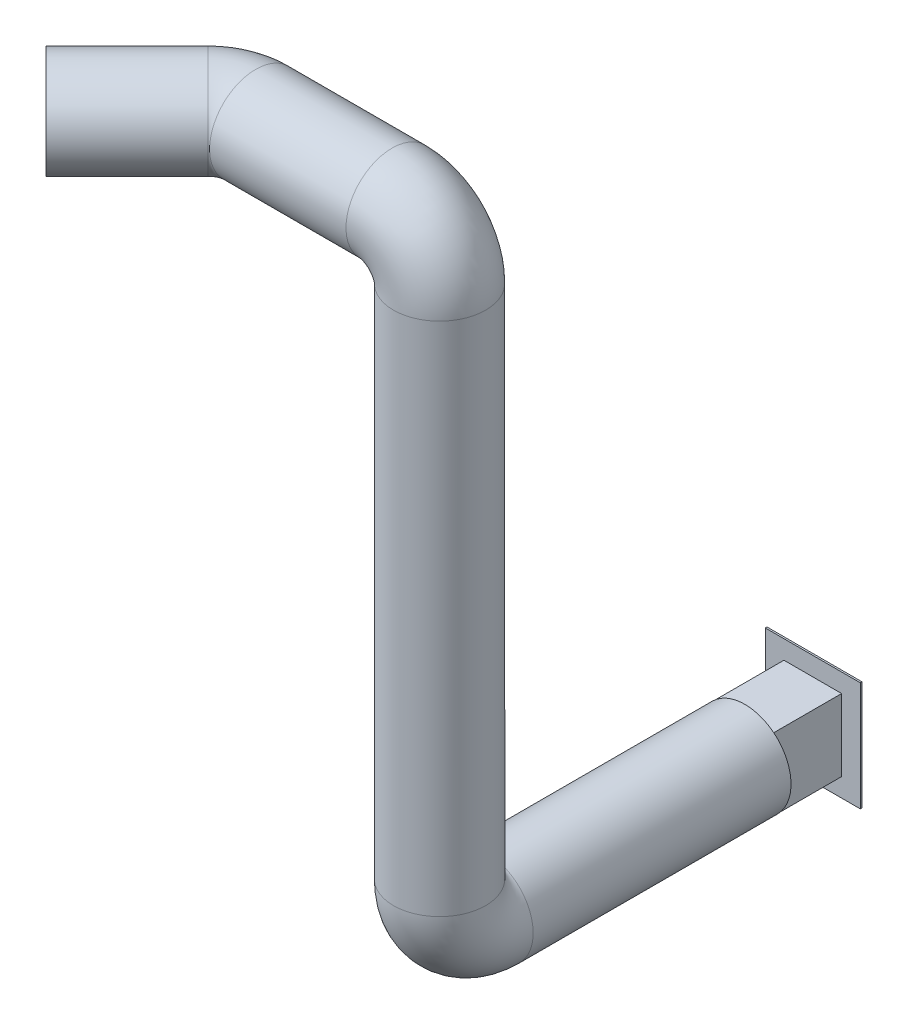
ISO-10303-21;
HEADER;
FILE_DESCRIPTION(('STEP AP214'),'2;1');
FILE_NAME('part.step','',(''),(''),'','','');
FILE_SCHEMA(('AUTOMOTIVE_DESIGN { 1 0 10303 214 1 1 1 1 }'));
ENDSEC;
DATA;
#1=APPLICATION_CONTEXT('core data for automotive mechanical design processes');
#2=APPLICATION_PROTOCOL_DEFINITION('international standard','automotive_design',2000,#1);
#3=PRODUCT_CONTEXT('',#1,'mechanical');
#4=PRODUCT('Part','Part','',(#3));
#5=PRODUCT_RELATED_PRODUCT_CATEGORY('part','',(#4));
#6=PRODUCT_DEFINITION_FORMATION('','',#4);
#7=PRODUCT_DEFINITION_CONTEXT('part definition',#1,'design');
#8=PRODUCT_DEFINITION('design','',#6,#7);
#9=PRODUCT_DEFINITION_SHAPE('','',#8);
#10=(LENGTH_UNIT() NAMED_UNIT(*) SI_UNIT(.MILLI.,.METRE.));
#11=(NAMED_UNIT(*) PLANE_ANGLE_UNIT() SI_UNIT($,.RADIAN.));
#12=(NAMED_UNIT(*) SI_UNIT($,.STERADIAN.) SOLID_ANGLE_UNIT());
#13=UNCERTAINTY_MEASURE_WITH_UNIT(LENGTH_MEASURE(1.E-05),#10,'distance_accuracy_value','');
#14=(GEOMETRIC_REPRESENTATION_CONTEXT(3) GLOBAL_UNCERTAINTY_ASSIGNED_CONTEXT((#13)) GLOBAL_UNIT_ASSIGNED_CONTEXT((#10,
#11,#12)) REPRESENTATION_CONTEXT('',''));
#15=CARTESIAN_POINT('',(0.,0.,0.));
#16=DIRECTION('',(0.,0.,1.));
#17=DIRECTION('',(1.,0.,0.));
#18=AXIS2_PLACEMENT_3D('',#15,#16,#17);
#19=CARTESIAN_POINT('',(0.,0.,2.5));
#20=DIRECTION('',(0.,0.,1.));
#21=DIRECTION('',(1.,0.,0.));
#22=AXIS2_PLACEMENT_3D('',#19,#20,#21);
#23=PLANE('',#22);
#24=DIRECTION('',(0.,-1.,0.));
#25=VECTOR('',#24,1.);
#26=CARTESIAN_POINT('',(0.,0.,2.5));
#27=LINE('',#26,#25);
#28=CARTESIAN_POINT('',(0.,0.,2.5));
#29=VERTEX_POINT('',#28);
#30=CARTESIAN_POINT('',(0.,-161.,2.5));
#31=VERTEX_POINT('',#30);
#32=EDGE_CURVE('E204',#29,#31,#27,.T.);
#33=ORIENTED_EDGE('',*,*,#32,.T.);
#34=DIRECTION('',(1.,0.,0.));
#35=VECTOR('',#34,1.);
#36=CARTESIAN_POINT('',(0.,-161.,2.5));
#37=LINE('',#36,#35);
#38=CARTESIAN_POINT('',(140.,-161.,2.5));
#39=VERTEX_POINT('',#38);
#40=EDGE_CURVE('E207',#31,#39,#37,.T.);
#41=ORIENTED_EDGE('',*,*,#40,.T.);
#42=DIRECTION('',(0.,1.,0.));
#43=VECTOR('',#42,1.);
#44=CARTESIAN_POINT('',(140.,0.,2.5));
#45=LINE('',#44,#43);
#46=CARTESIAN_POINT('',(140.,0.,2.5));
#47=VERTEX_POINT('',#46);
#48=EDGE_CURVE('E210',#39,#47,#45,.T.);
#49=ORIENTED_EDGE('',*,*,#48,.T.);
#50=DIRECTION('',(-1.,0.,0.));
#51=VECTOR('',#50,1.);
#52=CARTESIAN_POINT('',(0.,0.,2.5));
#53=LINE('',#52,#51);
#54=EDGE_CURVE('E212',#47,#29,#53,.T.);
#55=ORIENTED_EDGE('',*,*,#54,.T.);
#56=EDGE_LOOP('',(#33,#41,#49,#55));
#57=FACE_BOUND('',#56,.T.);
#58=DIRECTION('',(0.,-1.,0.));
#59=VECTOR('',#58,1.);
#60=CARTESIAN_POINT('',(27.5,-27.5,2.5));
#61=LINE('',#60,#59);
#62=CARTESIAN_POINT('',(27.5,-27.5,2.5));
#63=VERTEX_POINT('',#62);
#64=CARTESIAN_POINT('',(27.5,-133.5,2.5));
#65=VERTEX_POINT('',#64);
#66=EDGE_CURVE('E172',#63,#65,#61,.T.);
#67=ORIENTED_EDGE('',*,*,#66,.F.);
#68=DIRECTION('',(-1.,0.,0.));
#69=VECTOR('',#68,1.);
#70=CARTESIAN_POINT('',(27.5,-27.5,2.5));
#71=LINE('',#70,#69);
#72=CARTESIAN_POINT('',(112.5,-27.5,2.5));
#73=VERTEX_POINT('',#72);
#74=EDGE_CURVE('E155',#73,#63,#71,.T.);
#75=ORIENTED_EDGE('',*,*,#74,.F.);
#76=DIRECTION('',(0.,1.,0.));
#77=VECTOR('',#76,1.);
#78=CARTESIAN_POINT('',(112.5,-27.5,2.5));
#79=LINE('',#78,#77);
#80=CARTESIAN_POINT('',(112.5,-133.5,2.5));
#81=VERTEX_POINT('',#80);
#82=EDGE_CURVE('E160',#81,#73,#79,.T.);
#83=ORIENTED_EDGE('',*,*,#82,.F.);
#84=DIRECTION('',(1.,0.,0.));
#85=VECTOR('',#84,1.);
#86=CARTESIAN_POINT('',(27.5,-133.5,2.5));
#87=LINE('',#86,#85);
#88=EDGE_CURVE('E174',#65,#81,#87,.T.);
#89=ORIENTED_EDGE('',*,*,#88,.F.);
#90=EDGE_LOOP('',(#67,#75,#83,#89));
#91=FACE_BOUND('',#90,.T.);
#92=ADVANCED_FACE('F33',(#57,#91),#23,.T.);
#93=CARTESIAN_POINT('',(0.,0.,0.));
#94=DIRECTION('',(0.,0.,1.));
#95=DIRECTION('',(1.,0.,0.));
#96=AXIS2_PLACEMENT_3D('',#93,#94,#95);
#97=PLANE('',#96);
#98=DIRECTION('',(0.,-1.,0.));
#99=VECTOR('',#98,1.);
#100=CARTESIAN_POINT('',(0.,0.,0.));
#101=LINE('',#100,#99);
#102=CARTESIAN_POINT('',(0.,0.,0.));
#103=VERTEX_POINT('',#102);
#104=CARTESIAN_POINT('',(0.,-161.,0.));
#105=VERTEX_POINT('',#104);
#106=EDGE_CURVE('E203',#103,#105,#101,.T.);
#107=ORIENTED_EDGE('',*,*,#106,.F.);
#108=DIRECTION('',(-1.,0.,0.));
#109=VECTOR('',#108,1.);
#110=CARTESIAN_POINT('',(0.,0.,0.));
#111=LINE('',#110,#109);
#112=CARTESIAN_POINT('',(140.,0.,0.));
#113=VERTEX_POINT('',#112);
#114=EDGE_CURVE('E208',#113,#103,#111,.T.);
#115=ORIENTED_EDGE('',*,*,#114,.F.);
#116=DIRECTION('',(0.,1.,0.));
#117=VECTOR('',#116,1.);
#118=CARTESIAN_POINT('',(140.,0.,0.));
#119=LINE('',#118,#117);
#120=CARTESIAN_POINT('',(140.,-161.,0.));
#121=VERTEX_POINT('',#120);
#122=EDGE_CURVE('E219',#121,#113,#119,.T.);
#123=ORIENTED_EDGE('',*,*,#122,.F.);
#124=DIRECTION('',(1.,0.,0.));
#125=VECTOR('',#124,1.);
#126=CARTESIAN_POINT('',(0.,-161.,0.));
#127=LINE('',#126,#125);
#128=EDGE_CURVE('E217',#105,#121,#127,.T.);
#129=ORIENTED_EDGE('',*,*,#128,.F.);
#130=EDGE_LOOP('',(#107,#115,#123,#129));
#131=FACE_BOUND('',#130,.T.);
#132=DIRECTION('',(0.,1.,0.));
#133=VECTOR('',#132,1.);
#134=CARTESIAN_POINT('',(110.,-131.,0.));
#135=LINE('',#134,#133);
#136=CARTESIAN_POINT('',(110.,-131.,0.));
#137=VERTEX_POINT('',#136);
#138=CARTESIAN_POINT('',(110.,-30.,0.));
#139=VERTEX_POINT('',#138);
#140=EDGE_CURVE('E56',#137,#139,#135,.T.);
#141=ORIENTED_EDGE('',*,*,#140,.T.);
#142=DIRECTION('',(-1.,0.,0.));
#143=VECTOR('',#142,1.);
#144=CARTESIAN_POINT('',(30.,-30.,0.));
#145=LINE('',#144,#143);
#146=CARTESIAN_POINT('',(30.,-30.,0.));
#147=VERTEX_POINT('',#146);
#148=EDGE_CURVE('E186',#139,#147,#145,.T.);
#149=ORIENTED_EDGE('',*,*,#148,.T.);
#150=DIRECTION('',(0.,-1.,0.));
#151=VECTOR('',#150,1.);
#152=CARTESIAN_POINT('',(30.,-131.,0.));
#153=LINE('',#152,#151);
#154=CARTESIAN_POINT('',(30.,-131.,0.));
#155=VERTEX_POINT('',#154);
#156=EDGE_CURVE('E189',#147,#155,#153,.T.);
#157=ORIENTED_EDGE('',*,*,#156,.T.);
#158=DIRECTION('',(1.,0.,0.));
#159=VECTOR('',#158,1.);
#160=CARTESIAN_POINT('',(30.,-131.,0.));
#161=LINE('',#160,#159);
#162=EDGE_CURVE('E192',#155,#137,#161,.T.);
#163=ORIENTED_EDGE('',*,*,#162,.T.);
#164=EDGE_LOOP('',(#141,#149,#157,#163));
#165=FACE_BOUND('',#164,.T.);
#166=ADVANCED_FACE('F237',(#131,#165),#97,.F.);
#167=CARTESIAN_POINT('',(0.,0.,2.5));
#168=DIRECTION('',(1.,0.,0.));
#169=DIRECTION('',(0.,0.,-1.));
#170=AXIS2_PLACEMENT_3D('',#167,#168,#169);
#171=PLANE('',#170);
#172=ORIENTED_EDGE('',*,*,#106,.T.);
#173=DIRECTION('',(0.,0.,-1.));
#174=VECTOR('',#173,1.);
#175=CARTESIAN_POINT('',(0.,-161.,2.5));
#176=LINE('',#175,#174);
#177=EDGE_CURVE('E11',#31,#105,#176,.T.);
#178=ORIENTED_EDGE('',*,*,#177,.F.);
#179=ORIENTED_EDGE('',*,*,#32,.F.);
#180=DIRECTION('',(0.,0.,-1.));
#181=VECTOR('',#180,1.);
#182=CARTESIAN_POINT('',(0.,0.,2.5));
#183=LINE('',#182,#181);
#184=EDGE_CURVE('E214',#29,#103,#183,.T.);
#185=ORIENTED_EDGE('',*,*,#184,.T.);
#186=EDGE_LOOP('',(#172,#178,#179,#185));
#187=FACE_BOUND('',#186,.T.);
#188=ADVANCED_FACE('F35',(#187),#171,.F.);
#189=CARTESIAN_POINT('',(0.,-161.,2.5));
#190=DIRECTION('',(0.,1.,0.));
#191=DIRECTION('',(0.,0.,1.));
#192=AXIS2_PLACEMENT_3D('',#189,#190,#191);
#193=PLANE('',#192);
#194=ORIENTED_EDGE('',*,*,#128,.T.);
#195=DIRECTION('',(0.,0.,-1.));
#196=VECTOR('',#195,1.);
#197=CARTESIAN_POINT('',(140.,-161.,2.5));
#198=LINE('',#197,#196);
#199=EDGE_CURVE('E41',#39,#121,#198,.T.);
#200=ORIENTED_EDGE('',*,*,#199,.F.);
#201=ORIENTED_EDGE('',*,*,#40,.F.);
#202=ORIENTED_EDGE('',*,*,#177,.T.);
#203=EDGE_LOOP('',(#194,#200,#201,#202));
#204=FACE_BOUND('',#203,.T.);
#205=ADVANCED_FACE('F248',(#204),#193,.F.);
#206=CARTESIAN_POINT('',(140.,0.,2.5));
#207=DIRECTION('',(-1.,0.,0.));
#208=DIRECTION('',(0.,0.,1.));
#209=AXIS2_PLACEMENT_3D('',#206,#207,#208);
#210=PLANE('',#209);
#211=ORIENTED_EDGE('',*,*,#122,.T.);
#212=DIRECTION('',(0.,0.,-1.));
#213=VECTOR('',#212,1.);
#214=CARTESIAN_POINT('',(140.,0.,2.5));
#215=LINE('',#214,#213);
#216=EDGE_CURVE('E224',#47,#113,#215,.T.);
#217=ORIENTED_EDGE('',*,*,#216,.F.);
#218=ORIENTED_EDGE('',*,*,#48,.F.);
#219=ORIENTED_EDGE('',*,*,#199,.T.);
#220=EDGE_LOOP('',(#211,#217,#218,#219));
#221=FACE_BOUND('',#220,.T.);
#222=ADVANCED_FACE('F231',(#221),#210,.F.);
#223=CARTESIAN_POINT('',(0.,0.,2.5));
#224=DIRECTION('',(0.,-1.,0.));
#225=DIRECTION('',(1.,0.,0.));
#226=AXIS2_PLACEMENT_3D('',#223,#224,#225);
#227=PLANE('',#226);
#228=ORIENTED_EDGE('',*,*,#114,.T.);
#229=ORIENTED_EDGE('',*,*,#184,.F.);
#230=ORIENTED_EDGE('',*,*,#54,.F.);
#231=ORIENTED_EDGE('',*,*,#216,.T.);
#232=EDGE_LOOP('',(#228,#229,#230,#231));
#233=FACE_BOUND('',#232,.T.);
#234=ADVANCED_FACE('F241',(#233),#227,.F.);
#235=CARTESIAN_POINT('',(110.,-131.,2.5));
#236=DIRECTION('',(-1.,0.,0.));
#237=DIRECTION('',(0.,0.,1.));
#238=AXIS2_PLACEMENT_3D('',#235,#236,#237);
#239=PLANE('',#238);
#240=ORIENTED_EDGE('',*,*,#140,.F.);
#241=DIRECTION('',(0.,0.,-1.));
#242=VECTOR('',#241,1.);
#243=CARTESIAN_POINT('',(110.,-131.,2.5));
#244=LINE('',#243,#242);
#245=CARTESIAN_POINT('',(110.,-131.,102.5));
#246=VERTEX_POINT('',#245);
#247=EDGE_CURVE('E195',#246,#137,#244,.T.);
#248=ORIENTED_EDGE('',*,*,#247,.F.);
#249=DIRECTION('',(0.,1.,0.));
#250=VECTOR('',#249,1.);
#251=CARTESIAN_POINT('',(110.,-30.,102.5));
#252=LINE('',#251,#250);
#253=CARTESIAN_POINT('',(110.,-30.,102.5));
#254=VERTEX_POINT('',#253);
#255=EDGE_CURVE('E149',#246,#254,#252,.T.);
#256=ORIENTED_EDGE('',*,*,#255,.T.);
#257=DIRECTION('',(0.,0.,-1.));
#258=VECTOR('',#257,1.);
#259=CARTESIAN_POINT('',(110.,-30.,2.5));
#260=LINE('',#259,#258);
#261=EDGE_CURVE('E201',#254,#139,#260,.T.);
#262=ORIENTED_EDGE('',*,*,#261,.T.);
#263=EDGE_LOOP('',(#240,#248,#256,#262));
#264=FACE_BOUND('',#263,.T.);
#265=ADVANCED_FACE('F262',(#264),#239,.T.);
#266=CARTESIAN_POINT('',(30.,-30.,2.5));
#267=DIRECTION('',(0.,-1.,0.));
#268=DIRECTION('',(0.,0.,-1.));
#269=AXIS2_PLACEMENT_3D('',#266,#267,#268);
#270=PLANE('',#269);
#271=ORIENTED_EDGE('',*,*,#148,.F.);
#272=ORIENTED_EDGE('',*,*,#261,.F.);
#273=DIRECTION('',(-1.,0.,0.));
#274=VECTOR('',#273,1.);
#275=CARTESIAN_POINT('',(30.,-30.,102.5));
#276=LINE('',#275,#274);
#277=CARTESIAN_POINT('',(30.,-30.,102.5));
#278=VERTEX_POINT('',#277);
#279=EDGE_CURVE('E152',#254,#278,#276,.T.);
#280=ORIENTED_EDGE('',*,*,#279,.T.);
#281=DIRECTION('',(0.,0.,-1.));
#282=VECTOR('',#281,1.);
#283=CARTESIAN_POINT('',(30.,-30.,2.5));
#284=LINE('',#283,#282);
#285=EDGE_CURVE('E199',#278,#147,#284,.T.);
#286=ORIENTED_EDGE('',*,*,#285,.T.);
#287=EDGE_LOOP('',(#271,#272,#280,#286));
#288=FACE_BOUND('',#287,.T.);
#289=ADVANCED_FACE('F269',(#288),#270,.T.);
#290=CARTESIAN_POINT('',(30.,-131.,2.5));
#291=DIRECTION('',(1.,0.,0.));
#292=DIRECTION('',(0.,0.,-1.));
#293=AXIS2_PLACEMENT_3D('',#290,#291,#292);
#294=PLANE('',#293);
#295=ORIENTED_EDGE('',*,*,#156,.F.);
#296=ORIENTED_EDGE('',*,*,#285,.F.);
#297=DIRECTION('',(0.,-1.,0.));
#298=VECTOR('',#297,1.);
#299=CARTESIAN_POINT('',(30.,-30.,102.5));
#300=LINE('',#299,#298);
#301=CARTESIAN_POINT('',(30.,-131.,102.5));
#302=VERTEX_POINT('',#301);
#303=EDGE_CURVE('E142',#278,#302,#300,.T.);
#304=ORIENTED_EDGE('',*,*,#303,.T.);
#305=DIRECTION('',(0.,0.,-1.));
#306=VECTOR('',#305,1.);
#307=CARTESIAN_POINT('',(30.,-131.,2.5));
#308=LINE('',#307,#306);
#309=EDGE_CURVE('E197',#302,#155,#308,.T.);
#310=ORIENTED_EDGE('',*,*,#309,.T.);
#311=EDGE_LOOP('',(#295,#296,#304,#310));
#312=FACE_BOUND('',#311,.T.);
#313=ADVANCED_FACE('F273',(#312),#294,.T.);
#314=CARTESIAN_POINT('',(30.,-131.,2.5));
#315=DIRECTION('',(0.,1.,0.));
#316=DIRECTION('',(0.,0.,1.));
#317=AXIS2_PLACEMENT_3D('',#314,#315,#316);
#318=PLANE('',#317);
#319=ORIENTED_EDGE('',*,*,#162,.F.);
#320=ORIENTED_EDGE('',*,*,#309,.F.);
#321=DIRECTION('',(1.,0.,0.));
#322=VECTOR('',#321,1.);
#323=CARTESIAN_POINT('',(30.,-131.,102.5));
#324=LINE('',#323,#322);
#325=EDGE_CURVE('E146',#302,#246,#324,.T.);
#326=ORIENTED_EDGE('',*,*,#325,.T.);
#327=ORIENTED_EDGE('',*,*,#247,.T.);
#328=EDGE_LOOP('',(#319,#320,#326,#327));
#329=FACE_BOUND('',#328,.T.);
#330=ADVANCED_FACE('F278',(#329),#318,.T.);
#331=CARTESIAN_POINT('',(27.5,-27.5,102.5));
#332=DIRECTION('',(0.,-1.,0.));
#333=DIRECTION('',(0.,0.,-1.));
#334=AXIS2_PLACEMENT_3D('',#331,#332,#333);
#335=PLANE('',#334);
#336=ORIENTED_EDGE('',*,*,#74,.T.);
#337=DIRECTION('',(0.,0.,-1.));
#338=VECTOR('',#337,1.);
#339=CARTESIAN_POINT('',(27.5,-27.5,102.5));
#340=LINE('',#339,#338);
#341=CARTESIAN_POINT('',(27.5,-27.5,102.5));
#342=VERTEX_POINT('',#341);
#343=EDGE_CURVE('E183',#342,#63,#340,.T.);
#344=ORIENTED_EDGE('',*,*,#343,.F.);
#345=DIRECTION('',(-1.,0.,0.));
#346=VECTOR('',#345,1.);
#347=CARTESIAN_POINT('',(27.5,-27.5,102.5));
#348=LINE('',#347,#346);
#349=CARTESIAN_POINT('',(112.5,-27.5,102.5));
#350=VERTEX_POINT('',#349);
#351=EDGE_CURVE('E156',#350,#342,#348,.T.);
#352=ORIENTED_EDGE('',*,*,#351,.F.);
#353=DIRECTION('',(0.,0.,-1.));
#354=VECTOR('',#353,1.);
#355=CARTESIAN_POINT('',(112.5,-27.5,102.5));
#356=LINE('',#355,#354);
#357=EDGE_CURVE('E169',#350,#73,#356,.T.);
#358=ORIENTED_EDGE('',*,*,#357,.T.);
#359=EDGE_LOOP('',(#336,#344,#352,#358));
#360=FACE_BOUND('',#359,.T.);
#361=ADVANCED_FACE('F284',(#360),#335,.F.);
#362=CARTESIAN_POINT('',(27.5,-27.5,102.5));
#363=DIRECTION('',(1.,0.,0.));
#364=DIRECTION('',(0.,0.,-1.));
#365=AXIS2_PLACEMENT_3D('',#362,#363,#364);
#366=PLANE('',#365);
#367=ORIENTED_EDGE('',*,*,#66,.T.);
#368=DIRECTION('',(0.,0.,-1.));
#369=VECTOR('',#368,1.);
#370=CARTESIAN_POINT('',(27.5,-133.5,102.5));
#371=LINE('',#370,#369);
#372=CARTESIAN_POINT('',(27.5,-133.5,102.5));
#373=VERTEX_POINT('',#372);
#374=EDGE_CURVE('E180',#373,#65,#371,.T.);
#375=ORIENTED_EDGE('',*,*,#374,.F.);
#376=DIRECTION('',(0.,-1.,0.));
#377=VECTOR('',#376,1.);
#378=CARTESIAN_POINT('',(27.5,-27.5,102.5));
#379=LINE('',#378,#377);
#380=EDGE_CURVE('E159',#342,#373,#379,.T.);
#381=ORIENTED_EDGE('',*,*,#380,.F.);
#382=ORIENTED_EDGE('',*,*,#343,.T.);
#383=EDGE_LOOP('',(#367,#375,#381,#382));
#384=FACE_BOUND('',#383,.T.);
#385=ADVANCED_FACE('F288',(#384),#366,.F.);
#386=CARTESIAN_POINT('',(27.5,-133.5,102.5));
#387=DIRECTION('',(0.,1.,0.));
#388=DIRECTION('',(0.,0.,1.));
#389=AXIS2_PLACEMENT_3D('',#386,#387,#388);
#390=PLANE('',#389);
#391=ORIENTED_EDGE('',*,*,#88,.T.);
#392=DIRECTION('',(0.,0.,-1.));
#393=VECTOR('',#392,1.);
#394=CARTESIAN_POINT('',(112.5,-133.5,102.5));
#395=LINE('',#394,#393);
#396=CARTESIAN_POINT('',(112.5,-133.5,102.5));
#397=VERTEX_POINT('',#396);
#398=EDGE_CURVE('E48',#397,#81,#395,.T.);
#399=ORIENTED_EDGE('',*,*,#398,.F.);
#400=DIRECTION('',(1.,0.,0.));
#401=VECTOR('',#400,1.);
#402=CARTESIAN_POINT('',(27.5,-133.5,102.5));
#403=LINE('',#402,#401);
#404=EDGE_CURVE('E163',#373,#397,#403,.T.);
#405=ORIENTED_EDGE('',*,*,#404,.F.);
#406=ORIENTED_EDGE('',*,*,#374,.T.);
#407=EDGE_LOOP('',(#391,#399,#405,#406));
#408=FACE_BOUND('',#407,.T.);
#409=ADVANCED_FACE('F292',(#408),#390,.F.);
#410=CARTESIAN_POINT('',(112.5,-27.5,102.5));
#411=DIRECTION('',(-1.,0.,0.));
#412=DIRECTION('',(0.,0.,1.));
#413=AXIS2_PLACEMENT_3D('',#410,#411,#412);
#414=PLANE('',#413);
#415=ORIENTED_EDGE('',*,*,#82,.T.);
#416=ORIENTED_EDGE('',*,*,#357,.F.);
#417=DIRECTION('',(0.,1.,0.));
#418=VECTOR('',#417,1.);
#419=CARTESIAN_POINT('',(112.5,-27.5,102.5));
#420=LINE('',#419,#418);
#421=EDGE_CURVE('E166',#397,#350,#420,.T.);
#422=ORIENTED_EDGE('',*,*,#421,.F.);
#423=ORIENTED_EDGE('',*,*,#398,.T.);
#424=EDGE_LOOP('',(#415,#416,#422,#423));
#425=FACE_BOUND('',#424,.T.);
#426=ADVANCED_FACE('F296',(#425),#414,.F.);
#427=CARTESIAN_POINT('',(70.,-80.5,102.5));
#428=DIRECTION('',(0.,0.,1.));
#429=DIRECTION('',(1.,0.,0.));
#430=AXIS2_PLACEMENT_3D('',#427,#428,#429);
#431=PLANE('',#430);
#432=ORIENTED_EDGE('',*,*,#303,.F.);
#433=ORIENTED_EDGE('',*,*,#279,.F.);
#434=ORIENTED_EDGE('',*,*,#255,.F.);
#435=ORIENTED_EDGE('',*,*,#325,.F.);
#436=EDGE_LOOP('',(#432,#433,#434,#435));
#437=FACE_BOUND('',#436,.T.);
#438=ADVANCED_FACE('F300',(#437),#431,.F.);
#439=CARTESIAN_POINT('',(70.,-80.5,102.5));
#440=DIRECTION('',(0.,0.,1.));
#441=DIRECTION('',(1.,0.,0.));
#442=AXIS2_PLACEMENT_3D('',#439,#440,#441);
#443=CIRCLE('',#442,67.9356312990466);
#444=EDGE_CURVE('E135',#350,#342,#443,.T.);
#445=ORIENTED_EDGE('',*,*,#444,.F.);
#446=ORIENTED_EDGE('',*,*,#351,.T.);
#447=EDGE_LOOP('',(#445,#446));
#448=FACE_BOUND('',#447,.T.);
#449=ADVANCED_FACE('F310',(#448),#431,.F.);
#450=EDGE_CURVE('E143',#342,#373,#443,.T.);
#451=ORIENTED_EDGE('',*,*,#450,.F.);
#452=ORIENTED_EDGE('',*,*,#380,.T.);
#453=EDGE_LOOP('',(#451,#452));
#454=FACE_BOUND('',#453,.T.);
#455=ADVANCED_FACE('F420',(#454),#431,.F.);
#456=EDGE_CURVE('E133',#373,#397,#443,.T.);
#457=ORIENTED_EDGE('',*,*,#456,.F.);
#458=ORIENTED_EDGE('',*,*,#404,.T.);
#459=EDGE_LOOP('',(#457,#458));
#460=FACE_BOUND('',#459,.T.);
#461=ADVANCED_FACE('F305',(#460),#431,.F.);
#462=CARTESIAN_POINT('',(70.,-80.5,202.5));
#463=DIRECTION('',(0.,0.,-1.));
#464=DIRECTION('',(-1.,0.,0.));
#465=AXIS2_PLACEMENT_3D('',#462,#463,#464);
#466=CYLINDRICAL_SURFACE('',#465,67.9356312990466);
#467=ORIENTED_EDGE('',*,*,#444,.T.);
#468=ORIENTED_EDGE('',*,*,#450,.T.);
#469=ORIENTED_EDGE('',*,*,#456,.T.);
#470=EDGE_CURVE('E129',#397,#350,#443,.T.);
#471=ORIENTED_EDGE('',*,*,#470,.T.);
#472=EDGE_LOOP('',(#467,#468,#469,#471));
#473=FACE_BOUND('',#472,.T.);
#474=CARTESIAN_POINT('',(70.,-80.5,482.5));
#475=DIRECTION('',(0.,0.,1.));
#476=DIRECTION('',(1.,0.,0.));
#477=AXIS2_PLACEMENT_3D('',#474,#475,#476);
#478=CIRCLE('',#477,67.9356312990466);
#479=CARTESIAN_POINT('',(70.,-148.435631299047,482.5));
#480=VERTEX_POINT('',#479);
#481=EDGE_CURVE('E343',#480,#480,#478,.T.);
#482=ORIENTED_EDGE('',*,*,#481,.F.);
#483=EDGE_LOOP('',(#482));
#484=FACE_BOUND('',#483,.T.);
#485=ADVANCED_FACE('F301',(#473,#484),#466,.T.);
#486=ORIENTED_EDGE('',*,*,#470,.F.);
#487=ORIENTED_EDGE('',*,*,#421,.T.);
#488=EDGE_LOOP('',(#486,#487));
#489=FACE_BOUND('',#488,.T.);
#490=ADVANCED_FACE('F304',(#489),#431,.F.);
#491=CARTESIAN_POINT('',(-370.,819.5,692.5));
#492=DIRECTION('',(-0.707106781186548,0.,0.707106781186547));
#493=DIRECTION('',(0.,1.,0.));
#494=AXIS2_PLACEMENT_3D('',#491,#492,#493);
#495=PLANE('',#494);
#496=CARTESIAN_POINT('',(-370.,819.5,692.5));
#497=DIRECTION('',(-0.707106781186548,0.,0.707106781186547));
#498=DIRECTION('',(0.,1.,0.));
#499=AXIS2_PLACEMENT_3D('',#496,#497,#498);
#500=CIRCLE('',#499,67.9356312990466);
#501=CARTESIAN_POINT('',(-370.,887.435631299047,692.5));
#502=VERTEX_POINT('',#501);
#503=EDGE_CURVE('E126',#502,#502,#500,.T.);
#504=ORIENTED_EDGE('',*,*,#503,.T.);
#505=EDGE_LOOP('',(#504));
#506=FACE_BOUND('',#505,.T.);
#507=ADVANCED_FACE('F127',(#506),#495,.T.);
#508=CARTESIAN_POINT('',(70.,-10.5,482.5));
#509=DIRECTION('',(-1.,0.,0.));
#510=DIRECTION('',(0.,0.,1.));
#511=AXIS2_PLACEMENT_3D('',#508,#509,#510);
#512=TOROIDAL_SURFACE('',#511,70.,67.9356312990466);
#513=CARTESIAN_POINT('',(70.,-10.5,552.5));
#514=DIRECTION('',(0.,1.,0.));
#515=DIRECTION('',(1.,0.,0.));
#516=AXIS2_PLACEMENT_3D('',#513,#514,#515);
#517=CIRCLE('',#516,67.9356312990466);
#518=CARTESIAN_POINT('',(70.,-10.5,620.435631299047));
#519=VERTEX_POINT('',#518);
#520=EDGE_CURVE('E340',#519,#519,#517,.T.);
#521=CARTESIAN_POINT('',(70.,-10.5,482.5));
#522=DIRECTION('',(-1.,0.,0.));
#523=DIRECTION('',(0.,0.,1.));
#524=AXIS2_PLACEMENT_3D('',#521,#522,#523);
#525=CIRCLE('',#524,137.935631299047);
#526=EDGE_CURVE('',#480,#519,#525,.T.);
#527=ORIENTED_EDGE('',*,*,#481,.T.);
#528=ORIENTED_EDGE('',*,*,#520,.F.);
#529=ORIENTED_EDGE('',*,*,#526,.T.);
#530=ORIENTED_EDGE('',*,*,#526,.F.);
#531=EDGE_LOOP('',(#527,#529,#528,#530));
#532=FACE_BOUND('',#531,.T.);
#533=ADVANCED_FACE('F314',(#532),#512,.T.);
#534=CARTESIAN_POINT('',(70.,-10.5,552.5));
#535=DIRECTION('',(0.,1.,0.));
#536=DIRECTION('',(0.,0.,1.));
#537=AXIS2_PLACEMENT_3D('',#534,#535,#536);
#538=CYLINDRICAL_SURFACE('',#537,67.9356312990466);
#539=CARTESIAN_POINT('',(70.,749.5,552.5));
#540=DIRECTION('',(0.,1.,0.));
#541=DIRECTION('',(1.,0.,0.));
#542=AXIS2_PLACEMENT_3D('',#539,#540,#541);
#543=CIRCLE('',#542,67.9356312990466);
#544=CARTESIAN_POINT('',(137.935631299047,749.5,552.5));
#545=VERTEX_POINT('',#544);
#546=EDGE_CURVE('E346',#545,#545,#543,.T.);
#547=ORIENTED_EDGE('',*,*,#546,.F.);
#548=EDGE_LOOP('',(#547));
#549=FACE_BOUND('',#548,.T.);
#550=ORIENTED_EDGE('',*,*,#520,.T.);
#551=EDGE_LOOP('',(#550));
#552=FACE_BOUND('',#551,.T.);
#553=ADVANCED_FACE('F328',(#549,#552),#538,.T.);
#554=CARTESIAN_POINT('',(0.,749.5,552.5));
#555=DIRECTION('',(0.,0.,1.));
#556=DIRECTION('',(1.,0.,0.));
#557=AXIS2_PLACEMENT_3D('',#554,#555,#556);
#558=TOROIDAL_SURFACE('',#557,70.,67.9356312990466);
#559=CARTESIAN_POINT('',(0.,819.5,552.5));
#560=DIRECTION('',(-1.,0.,0.));
#561=DIRECTION('',(0.,1.,0.));
#562=AXIS2_PLACEMENT_3D('',#559,#560,#561);
#563=CIRCLE('',#562,67.9356312990466);
#564=CARTESIAN_POINT('',(0.,887.435631299047,552.5));
#565=VERTEX_POINT('',#564);
#566=EDGE_CURVE('E351',#565,#565,#563,.T.);
#567=CARTESIAN_POINT('',(0.,749.5,552.5));
#568=DIRECTION('',(0.,0.,1.));
#569=DIRECTION('',(1.,0.,0.));
#570=AXIS2_PLACEMENT_3D('',#567,#568,#569);
#571=CIRCLE('',#570,137.935631299047);
#572=EDGE_CURVE('',#545,#565,#571,.T.);
#573=ORIENTED_EDGE('',*,*,#546,.T.);
#574=ORIENTED_EDGE('',*,*,#566,.F.);
#575=ORIENTED_EDGE('',*,*,#572,.T.);
#576=ORIENTED_EDGE('',*,*,#572,.F.);
#577=EDGE_LOOP('',(#573,#575,#574,#576));
#578=FACE_BOUND('',#577,.T.);
#579=ADVANCED_FACE('F324',(#578),#558,.T.);
#580=CARTESIAN_POINT('',(0.,819.5,552.5));
#581=DIRECTION('',(-1.,0.,0.));
#582=DIRECTION('',(0.,0.,1.));
#583=AXIS2_PLACEMENT_3D('',#580,#581,#582);
#584=CYLINDRICAL_SURFACE('',#583,67.9356312990466);
#585=CARTESIAN_POINT('',(-201.005050633883,819.5,552.5));
#586=DIRECTION('',(-1.,0.,0.));
#587=DIRECTION('',(0.,1.,0.));
#588=AXIS2_PLACEMENT_3D('',#585,#586,#587);
#589=CIRCLE('',#588,67.9356312990466);
#590=CARTESIAN_POINT('',(-201.005050633883,819.5,484.564368700953));
#591=VERTEX_POINT('',#590);
#592=EDGE_CURVE('E137',#591,#591,#589,.T.);
#593=ORIENTED_EDGE('',*,*,#592,.F.);
#594=EDGE_LOOP('',(#593));
#595=FACE_BOUND('',#594,.T.);
#596=ORIENTED_EDGE('',*,*,#566,.T.);
#597=EDGE_LOOP('',(#596));
#598=FACE_BOUND('',#597,.T.);
#599=ADVANCED_FACE('F320',(#595,#598),#584,.T.);
#600=CARTESIAN_POINT('',(-201.005050633883,819.5,622.5));
#601=DIRECTION('',(0.,1.,0.));
#602=DIRECTION('',(0.,0.,1.));
#603=AXIS2_PLACEMENT_3D('',#600,#601,#602);
#604=TOROIDAL_SURFACE('',#603,70.0000000000001,67.9356312990466);
#605=CARTESIAN_POINT('',(-250.502525316942,819.5,573.002525316942));
#606=DIRECTION('',(-0.707106781186548,0.,0.707106781186546));
#607=DIRECTION('',(0.,1.,0.));
#608=AXIS2_PLACEMENT_3D('',#605,#606,#607);
#609=CIRCLE('',#608,67.9356312990466);
#610=CARTESIAN_POINT('',(-298.540270892686,819.5,524.964779741197));
#611=VERTEX_POINT('',#610);
#612=EDGE_CURVE('E130',#611,#611,#609,.T.);
#613=CARTESIAN_POINT('',(-201.005050633883,819.5,622.5));
#614=DIRECTION('',(0.,1.,0.));
#615=DIRECTION('',(0.,0.,1.));
#616=AXIS2_PLACEMENT_3D('',#613,#614,#615);
#617=CIRCLE('',#616,137.935631299047);
#618=EDGE_CURVE('',#591,#611,#617,.T.);
#619=ORIENTED_EDGE('',*,*,#592,.T.);
#620=ORIENTED_EDGE('',*,*,#612,.F.);
#621=ORIENTED_EDGE('',*,*,#618,.T.);
#622=ORIENTED_EDGE('',*,*,#618,.F.);
#623=EDGE_LOOP('',(#619,#621,#620,#622));
#624=FACE_BOUND('',#623,.T.);
#625=ADVANCED_FACE('F317',(#624),#604,.T.);
#626=CARTESIAN_POINT('',(-250.502525316942,819.5,573.002525316942));
#627=DIRECTION('',(-0.707106781186548,0.,0.707106781186547));
#628=DIRECTION('',(0.707106781186547,0.,0.707106781186548));
#629=AXIS2_PLACEMENT_3D('',#626,#627,#628);
#630=CYLINDRICAL_SURFACE('',#629,67.9356312990466);
#631=ORIENTED_EDGE('',*,*,#503,.F.);
#632=EDGE_LOOP('',(#631));
#633=FACE_BOUND('',#632,.T.);
#634=ORIENTED_EDGE('',*,*,#612,.T.);
#635=EDGE_LOOP('',(#634));
#636=FACE_BOUND('',#635,.T.);
#637=ADVANCED_FACE('F311',(#633,#636),#630,.T.);
#638=CLOSED_SHELL('',(#92,#166,#188,#205,#222,#234,#265,#289,#313,#330,#361,#385,#409,#426,#438,
#449,#455,#461,#485,#490,#507,#533,#553,#579,#599,#625,#637));
#639=MANIFOLD_SOLID_BREP('B2',#638);
#640=ADVANCED_BREP_SHAPE_REPRESENTATION('',(#18,#639),#14);
#641=SHAPE_DEFINITION_REPRESENTATION(#9,#640);
ENDSEC;
END-ISO-10303-21;
